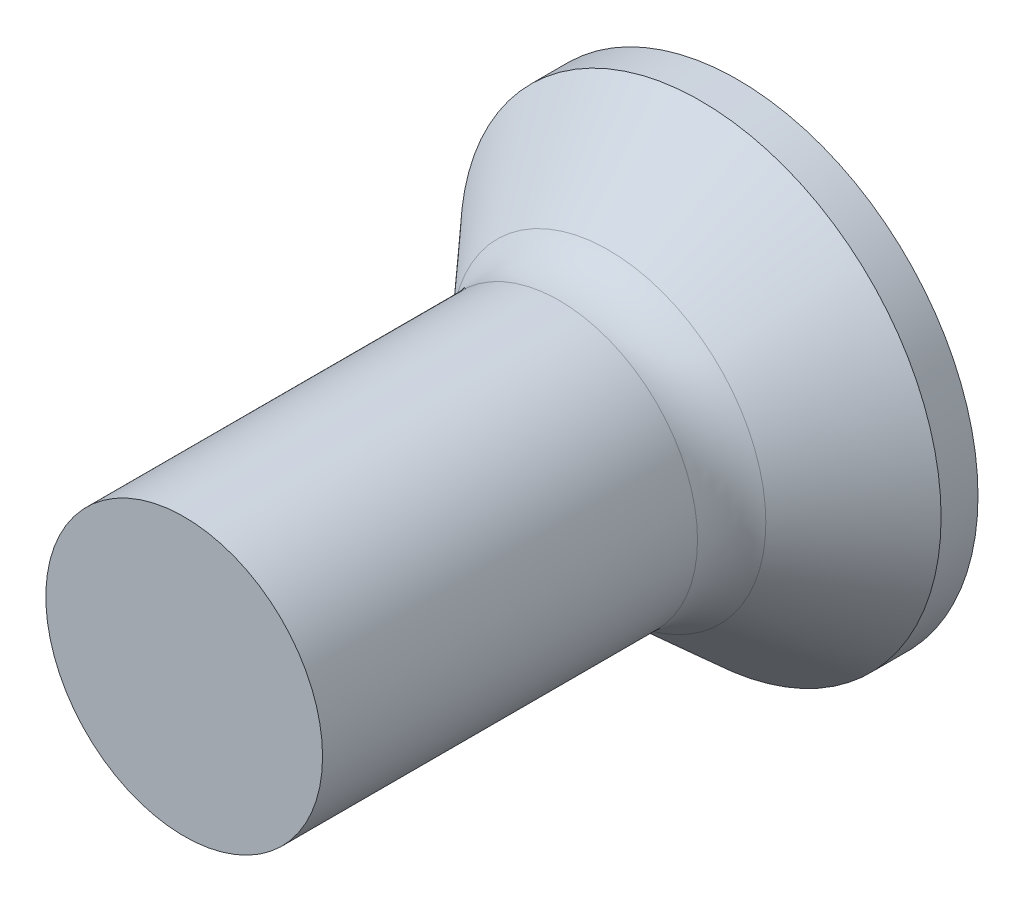
ISO-10303-21;
HEADER;
FILE_DESCRIPTION(('STEP AP214'),'2;1');
FILE_NAME('part.step','',(''),(''),'','','');
FILE_SCHEMA(('AUTOMOTIVE_DESIGN { 1 0 10303 214 1 1 1 1 }'));
ENDSEC;
DATA;
#1=APPLICATION_CONTEXT('core data for automotive mechanical design processes');
#2=APPLICATION_PROTOCOL_DEFINITION('international standard','automotive_design',2000,#1);
#3=PRODUCT_CONTEXT('',#1,'mechanical');
#4=PRODUCT('Part','Part','',(#3));
#5=PRODUCT_RELATED_PRODUCT_CATEGORY('part','',(#4));
#6=PRODUCT_DEFINITION_FORMATION('','',#4);
#7=PRODUCT_DEFINITION_CONTEXT('part definition',#1,'design');
#8=PRODUCT_DEFINITION('design','',#6,#7);
#9=PRODUCT_DEFINITION_SHAPE('','',#8);
#10=(LENGTH_UNIT() NAMED_UNIT(*) SI_UNIT(.MILLI.,.METRE.));
#11=(NAMED_UNIT(*) PLANE_ANGLE_UNIT() SI_UNIT($,.RADIAN.));
#12=(NAMED_UNIT(*) SI_UNIT($,.STERADIAN.) SOLID_ANGLE_UNIT());
#13=UNCERTAINTY_MEASURE_WITH_UNIT(LENGTH_MEASURE(1.E-05),#10,'distance_accuracy_value','');
#14=(GEOMETRIC_REPRESENTATION_CONTEXT(3) GLOBAL_UNCERTAINTY_ASSIGNED_CONTEXT((#13)) GLOBAL_UNIT_ASSIGNED_CONTEXT((#10,
#11,#12)) REPRESENTATION_CONTEXT('',''));
#15=CARTESIAN_POINT('',(0.,0.,0.));
#16=DIRECTION('',(0.,0.,1.));
#17=DIRECTION('',(1.,0.,0.));
#18=AXIS2_PLACEMENT_3D('',#15,#16,#17);
#19=CARTESIAN_POINT('',(0.35,0.5,-1.));
#20=DIRECTION('',(0.,0.,-1.));
#21=DIRECTION('',(-1.,0.,0.));
#22=AXIS2_PLACEMENT_3D('',#19,#20,#21);
#23=PLANE('',#22);
#24=DIRECTION('',(0.,-1.,0.));
#25=VECTOR('',#24,1.);
#26=CARTESIAN_POINT('',(-0.500000000000001,0.349999999999998,-1.));
#27=LINE('',#26,#25);
#28=CARTESIAN_POINT('',(-0.499999999999999,-0.229128784747794,-1.));
#29=VERTEX_POINT('',#28);
#30=CARTESIAN_POINT('',(-0.499999999999999,-0.350000000000002,-1.));
#31=VERTEX_POINT('',#30);
#32=EDGE_CURVE('E284',#29,#31,#27,.T.);
#33=ORIENTED_EDGE('',*,*,#32,.F.);
#34=CARTESIAN_POINT('',(0.,0.,-1.));
#35=DIRECTION('',(0.,0.,-1.));
#36=DIRECTION('',(-1.,0.,0.));
#37=AXIS2_PLACEMENT_3D('',#34,#35,#36);
#38=CIRCLE('',#37,0.55);
#39=CARTESIAN_POINT('',(-0.424264068711927,-0.350000000000001,-1.));
#40=VERTEX_POINT('',#39);
#41=EDGE_CURVE('E211',#29,#40,#38,.F.);
#42=ORIENTED_EDGE('',*,*,#41,.T.);
#43=DIRECTION('',(1.,0.,0.));
#44=VECTOR('',#43,1.);
#45=CARTESIAN_POINT('',(-0.499999999999999,-0.350000000000002,-1.));
#46=LINE('',#45,#44);
#47=EDGE_CURVE('E271',#31,#40,#46,.T.);
#48=ORIENTED_EDGE('',*,*,#47,.F.);
#49=EDGE_LOOP('',(#33,#42,#48));
#50=FACE_BOUND('',#49,.T.);
#51=ADVANCED_FACE('F34',(#50),#23,.T.);
#52=DIRECTION('',(0.,1.,0.));
#53=VECTOR('',#52,1.);
#54=CARTESIAN_POINT('',(-0.35,-0.5,-1.));
#55=LINE('',#54,#53);
#56=CARTESIAN_POINT('',(-0.35,-0.5,-1.));
#57=VERTEX_POINT('',#56);
#58=CARTESIAN_POINT('',(-0.35,-0.424264068711929,-1.));
#59=VERTEX_POINT('',#58);
#60=EDGE_CURVE('E256',#57,#59,#55,.T.);
#61=ORIENTED_EDGE('',*,*,#60,.T.);
#62=CARTESIAN_POINT('',(-0.229128784747792,-0.5,-1.));
#63=VERTEX_POINT('',#62);
#64=EDGE_CURVE('E205',#59,#63,#38,.F.);
#65=ORIENTED_EDGE('',*,*,#64,.T.);
#66=DIRECTION('',(1.,0.,0.));
#67=VECTOR('',#66,1.);
#68=CARTESIAN_POINT('',(-0.35,-0.5,-1.));
#69=LINE('',#68,#67);
#70=EDGE_CURVE('E260',#57,#63,#69,.T.);
#71=ORIENTED_EDGE('',*,*,#70,.F.);
#72=EDGE_LOOP('',(#61,#65,#71));
#73=FACE_BOUND('',#72,.T.);
#74=ADVANCED_FACE('F340',(#73),#23,.T.);
#75=CARTESIAN_POINT('',(0.229128784747792,-0.5,-1.));
#76=VERTEX_POINT('',#75);
#77=CARTESIAN_POINT('',(0.35,-0.5,-1.));
#78=VERTEX_POINT('',#77);
#79=EDGE_CURVE('E259',#76,#78,#69,.T.);
#80=ORIENTED_EDGE('',*,*,#79,.F.);
#81=CARTESIAN_POINT('',(0.35,-0.424264068711929,-1.));
#82=VERTEX_POINT('',#81);
#83=EDGE_CURVE('E201',#76,#82,#38,.F.);
#84=ORIENTED_EDGE('',*,*,#83,.T.);
#85=DIRECTION('',(0.,1.,0.));
#86=VECTOR('',#85,1.);
#87=CARTESIAN_POINT('',(0.35,-0.5,-1.));
#88=LINE('',#87,#86);
#89=EDGE_CURVE('E249',#78,#82,#88,.T.);
#90=ORIENTED_EDGE('',*,*,#89,.F.);
#91=EDGE_LOOP('',(#80,#84,#90));
#92=FACE_BOUND('',#91,.T.);
#93=ADVANCED_FACE('F347',(#92),#23,.T.);
#94=DIRECTION('',(-1.,0.,0.));
#95=VECTOR('',#94,1.);
#96=CARTESIAN_POINT('',(0.500000000000004,-0.349999999999995,-1.));
#97=LINE('',#96,#95);
#98=CARTESIAN_POINT('',(0.500000000000004,-0.349999999999995,-1.));
#99=VERTEX_POINT('',#98);
#100=CARTESIAN_POINT('',(0.424264068711932,-0.349999999999996,-1.));
#101=VERTEX_POINT('',#100);
#102=EDGE_CURVE('E234',#99,#101,#97,.T.);
#103=ORIENTED_EDGE('',*,*,#102,.T.);
#104=CARTESIAN_POINT('',(0.500000000000002,-0.229128784747786,-1.));
#105=VERTEX_POINT('',#104);
#106=EDGE_CURVE('E192',#101,#105,#38,.F.);
#107=ORIENTED_EDGE('',*,*,#106,.T.);
#108=DIRECTION('',(0.,1.,0.));
#109=VECTOR('',#108,1.);
#110=CARTESIAN_POINT('',(0.500000000000004,-0.349999999999995,-1.));
#111=LINE('',#110,#109);
#112=EDGE_CURVE('E238',#99,#105,#111,.T.);
#113=ORIENTED_EDGE('',*,*,#112,.F.);
#114=EDGE_LOOP('',(#103,#107,#113));
#115=FACE_BOUND('',#114,.T.);
#116=ADVANCED_FACE('F402',(#115),#23,.T.);
#117=CARTESIAN_POINT('',(0.499999999999998,0.229128784747797,-1.));
#118=VERTEX_POINT('',#117);
#119=CARTESIAN_POINT('',(0.499999999999996,0.350000000000005,-1.));
#120=VERTEX_POINT('',#119);
#121=EDGE_CURVE('E237',#118,#120,#111,.T.);
#122=ORIENTED_EDGE('',*,*,#121,.F.);
#123=CARTESIAN_POINT('',(0.424264068711927,0.350000000000001,-1.));
#124=VERTEX_POINT('',#123);
#125=EDGE_CURVE('E49',#118,#124,#38,.F.);
#126=ORIENTED_EDGE('',*,*,#125,.T.);
#127=DIRECTION('',(1.,0.,0.));
#128=VECTOR('',#127,1.);
#129=CARTESIAN_POINT('',(-0.500000000000001,0.349999999999998,-1.));
#130=LINE('',#129,#128);
#131=EDGE_CURVE('E280',#124,#120,#130,.T.);
#132=ORIENTED_EDGE('',*,*,#131,.T.);
#133=EDGE_LOOP('',(#122,#126,#132));
#134=FACE_BOUND('',#133,.T.);
#135=ADVANCED_FACE('F375',(#134),#23,.T.);
#136=DIRECTION('',(0.,-1.,0.));
#137=VECTOR('',#136,1.);
#138=CARTESIAN_POINT('',(0.35,0.5,-1.));
#139=LINE('',#138,#137);
#140=CARTESIAN_POINT('',(0.35,0.5,-1.));
#141=VERTEX_POINT('',#140);
#142=CARTESIAN_POINT('',(0.35,0.424264068711929,-1.));
#143=VERTEX_POINT('',#142);
#144=EDGE_CURVE('E302',#141,#143,#139,.T.);
#145=ORIENTED_EDGE('',*,*,#144,.T.);
#146=CARTESIAN_POINT('',(0.229128784747792,0.5,-1.));
#147=VERTEX_POINT('',#146);
#148=EDGE_CURVE('E193',#143,#147,#38,.F.);
#149=ORIENTED_EDGE('',*,*,#148,.T.);
#150=DIRECTION('',(-1.,0.,0.));
#151=VECTOR('',#150,1.);
#152=CARTESIAN_POINT('',(0.35,0.5,-1.));
#153=LINE('',#152,#151);
#154=EDGE_CURVE('E306',#141,#147,#153,.T.);
#155=ORIENTED_EDGE('',*,*,#154,.F.);
#156=EDGE_LOOP('',(#145,#149,#155));
#157=FACE_BOUND('',#156,.T.);
#158=ADVANCED_FACE('F367',(#157),#23,.T.);
#159=CARTESIAN_POINT('',(-0.229128784747792,0.5,-1.));
#160=VERTEX_POINT('',#159);
#161=CARTESIAN_POINT('',(-0.35,0.5,-1.));
#162=VERTEX_POINT('',#161);
#163=EDGE_CURVE('E305',#160,#162,#153,.T.);
#164=ORIENTED_EDGE('',*,*,#163,.F.);
#165=CARTESIAN_POINT('',(-0.35,0.424264068711929,-1.));
#166=VERTEX_POINT('',#165);
#167=EDGE_CURVE('E221',#160,#166,#38,.F.);
#168=ORIENTED_EDGE('',*,*,#167,.T.);
#169=DIRECTION('',(0.,-1.,0.));
#170=VECTOR('',#169,1.);
#171=CARTESIAN_POINT('',(-0.35,0.5,-1.));
#172=LINE('',#171,#170);
#173=EDGE_CURVE('E296',#162,#166,#172,.T.);
#174=ORIENTED_EDGE('',*,*,#173,.F.);
#175=EDGE_LOOP('',(#164,#168,#174));
#176=FACE_BOUND('',#175,.T.);
#177=ADVANCED_FACE('F356',(#176),#23,.T.);
#178=CARTESIAN_POINT('',(0.35,0.,0.));
#179=DIRECTION('',(1.,0.,0.));
#180=DIRECTION('',(0.,0.,-1.));
#181=AXIS2_PLACEMENT_3D('',#178,#179,#180);
#182=PLANE('',#181);
#183=DIRECTION('',(0.,0.,1.));
#184=VECTOR('',#183,1.);
#185=CARTESIAN_POINT('',(0.35,0.424264068711929,0.));
#186=LINE('',#185,#184);
#187=CARTESIAN_POINT('',(0.35,0.424264068711929,-3.));
#188=VERTEX_POINT('',#187);
#189=EDGE_CURVE('E225',#143,#188,#186,.F.);
#190=ORIENTED_EDGE('',*,*,#189,.F.);
#191=ORIENTED_EDGE('',*,*,#144,.F.);
#192=DIRECTION('',(0.,-0.446197813109803,0.894934361602028));
#193=VECTOR('',#192,1.);
#194=CARTESIAN_POINT('',(0.35,1.49716321610685,-3.));
#195=LINE('',#194,#193);
#196=CARTESIAN_POINT('',(0.35,1.49716321610685,-3.));
#197=VERTEX_POINT('',#196);
#198=EDGE_CURVE('E56',#197,#141,#195,.T.);
#199=ORIENTED_EDGE('',*,*,#198,.F.);
#200=DIRECTION('',(0.,1.,0.));
#201=VECTOR('',#200,1.);
#202=CARTESIAN_POINT('',(0.35,0.,-3.));
#203=LINE('',#202,#201);
#204=EDGE_CURVE('E299',#188,#197,#203,.T.);
#205=ORIENTED_EDGE('',*,*,#204,.F.);
#206=EDGE_LOOP('',(#190,#191,#199,#205));
#207=FACE_BOUND('',#206,.T.);
#208=ADVANCED_FACE('F366',(#207),#182,.F.);
#209=CARTESIAN_POINT('',(-0.35,0.,0.));
#210=DIRECTION('',(1.,0.,0.));
#211=DIRECTION('',(0.,0.,-1.));
#212=AXIS2_PLACEMENT_3D('',#209,#210,#211);
#213=PLANE('',#212);
#214=ORIENTED_EDGE('',*,*,#173,.T.);
#215=DIRECTION('',(0.,0.,1.));
#216=VECTOR('',#215,1.);
#217=CARTESIAN_POINT('',(-0.35,0.424264068711929,0.));
#218=LINE('',#217,#216);
#219=CARTESIAN_POINT('',(-0.35,0.424264068711929,-3.));
#220=VERTEX_POINT('',#219);
#221=EDGE_CURVE('E218',#166,#220,#218,.F.);
#222=ORIENTED_EDGE('',*,*,#221,.T.);
#223=DIRECTION('',(0.,1.,0.));
#224=VECTOR('',#223,1.);
#225=CARTESIAN_POINT('',(-0.35,0.,-3.));
#226=LINE('',#225,#224);
#227=CARTESIAN_POINT('',(-0.35,1.49716321610685,-3.));
#228=VERTEX_POINT('',#227);
#229=EDGE_CURVE('E291',#220,#228,#226,.T.);
#230=ORIENTED_EDGE('',*,*,#229,.T.);
#231=DIRECTION('',(0.,-0.446197813109803,0.894934361602028));
#232=VECTOR('',#231,1.);
#233=CARTESIAN_POINT('',(-0.35,1.49716321610685,-3.));
#234=LINE('',#233,#232);
#235=EDGE_CURVE('E293',#228,#162,#234,.T.);
#236=ORIENTED_EDGE('',*,*,#235,.T.);
#237=EDGE_LOOP('',(#214,#222,#230,#236));
#238=FACE_BOUND('',#237,.T.);
#239=ADVANCED_FACE('F373',(#238),#213,.T.);
#240=CARTESIAN_POINT('',(0.,0.35,0.));
#241=DIRECTION('',(0.,1.,0.));
#242=DIRECTION('',(0.,0.,-1.));
#243=AXIS2_PLACEMENT_3D('',#240,#241,#242);
#244=PLANE('',#243);
#245=DIRECTION('',(0.,0.,1.));
#246=VECTOR('',#245,1.);
#247=CARTESIAN_POINT('',(0.424264068711927,0.350000000000001,0.));
#248=LINE('',#247,#246);
#249=CARTESIAN_POINT('',(0.424264068711927,0.350000000000002,-3.));
#250=VERTEX_POINT('',#249);
#251=EDGE_CURVE('E196',#250,#124,#248,.T.);
#252=ORIENTED_EDGE('',*,*,#251,.F.);
#253=DIRECTION('',(-1.,0.,0.));
#254=VECTOR('',#253,1.);
#255=CARTESIAN_POINT('',(0.,0.35,-3.));
#256=LINE('',#255,#254);
#257=CARTESIAN_POINT('',(1.49716321610684,0.350000000000016,-3.));
#258=VERTEX_POINT('',#257);
#259=EDGE_CURVE('E275',#258,#250,#256,.T.);
#260=ORIENTED_EDGE('',*,*,#259,.F.);
#261=DIRECTION('',(-0.446197813109803,0.,0.894934361602028));
#262=VECTOR('',#261,1.);
#263=CARTESIAN_POINT('',(1.49716321610684,0.350000000000016,-3.));
#264=LINE('',#263,#262);
#265=EDGE_CURVE('E227',#258,#120,#264,.T.);
#266=ORIENTED_EDGE('',*,*,#265,.T.);
#267=ORIENTED_EDGE('',*,*,#131,.F.);
#268=EDGE_LOOP('',(#252,#260,#266,#267));
#269=FACE_BOUND('',#268,.T.);
#270=ADVANCED_FACE('F434',(#269),#244,.F.);
#271=DIRECTION('',(0.,0.,1.));
#272=VECTOR('',#271,1.);
#273=CARTESIAN_POINT('',(-0.42426406871193,0.349999999999999,0.));
#274=LINE('',#273,#272);
#275=CARTESIAN_POINT('',(-0.42426406871193,0.349999999999999,-1.));
#276=VERTEX_POINT('',#275);
#277=CARTESIAN_POINT('',(-0.42426406871193,0.349999999999999,-3.));
#278=VERTEX_POINT('',#277);
#279=EDGE_CURVE('E216',#276,#278,#274,.F.);
#280=ORIENTED_EDGE('',*,*,#279,.F.);
#281=CARTESIAN_POINT('',(-0.500000000000001,0.349999999999998,-1.));
#282=VERTEX_POINT('',#281);
#283=EDGE_CURVE('E281',#282,#276,#130,.T.);
#284=ORIENTED_EDGE('',*,*,#283,.F.);
#285=DIRECTION('',(0.446197813109803,0.,0.894934361602028));
#286=VECTOR('',#285,1.);
#287=CARTESIAN_POINT('',(-1.49716321610685,0.349999999999995,-3.));
#288=LINE('',#287,#286);
#289=CARTESIAN_POINT('',(-1.49716321610685,0.349999999999995,-3.));
#290=VERTEX_POINT('',#289);
#291=EDGE_CURVE('E278',#290,#282,#288,.T.);
#292=ORIENTED_EDGE('',*,*,#291,.F.);
#293=EDGE_CURVE('E274',#278,#290,#256,.T.);
#294=ORIENTED_EDGE('',*,*,#293,.F.);
#295=EDGE_LOOP('',(#280,#284,#292,#294));
#296=FACE_BOUND('',#295,.T.);
#297=ADVANCED_FACE('F436',(#296),#244,.F.);
#298=CARTESIAN_POINT('',(0.,-0.35,0.));
#299=DIRECTION('',(0.,1.,0.));
#300=DIRECTION('',(0.,0.,-1.));
#301=AXIS2_PLACEMENT_3D('',#298,#299,#300);
#302=PLANE('',#301);
#303=ORIENTED_EDGE('',*,*,#47,.T.);
#304=DIRECTION('',(0.,0.,1.));
#305=VECTOR('',#304,1.);
#306=CARTESIAN_POINT('',(-0.424264068711927,-0.350000000000001,0.));
#307=LINE('',#306,#305);
#308=CARTESIAN_POINT('',(-0.424264068711927,-0.350000000000002,-3.));
#309=VERTEX_POINT('',#308);
#310=EDGE_CURVE('E208',#40,#309,#307,.F.);
#311=ORIENTED_EDGE('',*,*,#310,.T.);
#312=DIRECTION('',(-1.,0.,0.));
#313=VECTOR('',#312,1.);
#314=CARTESIAN_POINT('',(0.,-0.35,-3.));
#315=LINE('',#314,#313);
#316=CARTESIAN_POINT('',(-1.49716321610685,-0.350000000000005,-3.));
#317=VERTEX_POINT('',#316);
#318=EDGE_CURVE('E266',#309,#317,#315,.T.);
#319=ORIENTED_EDGE('',*,*,#318,.T.);
#320=DIRECTION('',(0.446197813109803,0.,0.894934361602028));
#321=VECTOR('',#320,1.);
#322=CARTESIAN_POINT('',(-1.49716321610685,-0.350000000000005,-3.));
#323=LINE('',#322,#321);
#324=EDGE_CURVE('E268',#317,#31,#323,.T.);
#325=ORIENTED_EDGE('',*,*,#324,.T.);
#326=EDGE_LOOP('',(#303,#311,#319,#325));
#327=FACE_BOUND('',#326,.T.);
#328=ADVANCED_FACE('F442',(#327),#302,.T.);
#329=CARTESIAN_POINT('',(-0.35,0.,0.));
#330=DIRECTION('',(-1.,0.,0.));
#331=DIRECTION('',(0.,0.,-1.));
#332=AXIS2_PLACEMENT_3D('',#329,#330,#331);
#333=PLANE('',#332);
#334=DIRECTION('',(0.,0.,1.));
#335=VECTOR('',#334,1.);
#336=CARTESIAN_POINT('',(-0.35,-0.424264068711929,0.));
#337=LINE('',#336,#335);
#338=CARTESIAN_POINT('',(-0.35,-0.424264068711929,-3.));
#339=VERTEX_POINT('',#338);
#340=EDGE_CURVE('E206',#59,#339,#337,.F.);
#341=ORIENTED_EDGE('',*,*,#340,.F.);
#342=ORIENTED_EDGE('',*,*,#60,.F.);
#343=DIRECTION('',(0.,0.446197813109803,0.894934361602028));
#344=VECTOR('',#343,1.);
#345=CARTESIAN_POINT('',(-0.35,-1.49716321610685,-3.));
#346=LINE('',#345,#344);
#347=CARTESIAN_POINT('',(-0.35,-1.49716321610685,-3.));
#348=VERTEX_POINT('',#347);
#349=EDGE_CURVE('E254',#348,#57,#346,.T.);
#350=ORIENTED_EDGE('',*,*,#349,.F.);
#351=DIRECTION('',(0.,-1.,0.));
#352=VECTOR('',#351,1.);
#353=CARTESIAN_POINT('',(-0.35,0.,-3.));
#354=LINE('',#353,#352);
#355=EDGE_CURVE('E252',#339,#348,#354,.T.);
#356=ORIENTED_EDGE('',*,*,#355,.F.);
#357=EDGE_LOOP('',(#341,#342,#350,#356));
#358=FACE_BOUND('',#357,.T.);
#359=ADVANCED_FACE('F448',(#358),#333,.F.);
#360=CARTESIAN_POINT('',(0.35,0.,0.));
#361=DIRECTION('',(-1.,0.,0.));
#362=DIRECTION('',(0.,0.,-1.));
#363=AXIS2_PLACEMENT_3D('',#360,#361,#362);
#364=PLANE('',#363);
#365=ORIENTED_EDGE('',*,*,#89,.T.);
#366=DIRECTION('',(0.,0.,1.));
#367=VECTOR('',#366,1.);
#368=CARTESIAN_POINT('',(0.35,-0.424264068711929,0.));
#369=LINE('',#368,#367);
#370=CARTESIAN_POINT('',(0.35,-0.424264068711929,-3.));
#371=VERTEX_POINT('',#370);
#372=EDGE_CURVE('E198',#82,#371,#369,.F.);
#373=ORIENTED_EDGE('',*,*,#372,.T.);
#374=DIRECTION('',(0.,-1.,0.));
#375=VECTOR('',#374,1.);
#376=CARTESIAN_POINT('',(0.35,0.,-3.));
#377=LINE('',#376,#375);
#378=CARTESIAN_POINT('',(0.35,-1.49716321610685,-3.));
#379=VERTEX_POINT('',#378);
#380=EDGE_CURVE('E244',#371,#379,#377,.T.);
#381=ORIENTED_EDGE('',*,*,#380,.T.);
#382=DIRECTION('',(0.,0.446197813109803,0.894934361602028));
#383=VECTOR('',#382,1.);
#384=CARTESIAN_POINT('',(0.35,-1.49716321610685,-3.));
#385=LINE('',#384,#383);
#386=EDGE_CURVE('E246',#379,#78,#385,.T.);
#387=ORIENTED_EDGE('',*,*,#386,.T.);
#388=EDGE_LOOP('',(#365,#373,#381,#387));
#389=FACE_BOUND('',#388,.T.);
#390=ADVANCED_FACE('F418',(#389),#364,.T.);
#391=CARTESIAN_POINT('',(0.,-0.35,0.));
#392=DIRECTION('',(0.,-1.,0.));
#393=DIRECTION('',(0.,0.,-1.));
#394=AXIS2_PLACEMENT_3D('',#391,#392,#393);
#395=PLANE('',#394);
#396=DIRECTION('',(0.,0.,1.));
#397=VECTOR('',#396,1.);
#398=CARTESIAN_POINT('',(0.424264068711932,-0.349999999999996,0.));
#399=LINE('',#398,#397);
#400=CARTESIAN_POINT('',(0.424264068711932,-0.349999999999996,-3.));
#401=VERTEX_POINT('',#400);
#402=EDGE_CURVE('E194',#101,#401,#399,.F.);
#403=ORIENTED_EDGE('',*,*,#402,.F.);
#404=ORIENTED_EDGE('',*,*,#102,.F.);
#405=DIRECTION('',(-0.446197813109803,0.,0.894934361602028));
#406=VECTOR('',#405,1.);
#407=CARTESIAN_POINT('',(1.49716321610685,-0.349999999999984,-3.));
#408=LINE('',#407,#406);
#409=CARTESIAN_POINT('',(1.49716321610685,-0.349999999999984,-3.));
#410=VERTEX_POINT('',#409);
#411=EDGE_CURVE('E232',#410,#99,#408,.T.);
#412=ORIENTED_EDGE('',*,*,#411,.F.);
#413=DIRECTION('',(1.,0.,0.));
#414=VECTOR('',#413,1.);
#415=CARTESIAN_POINT('',(0.,-0.35,-3.));
#416=LINE('',#415,#414);
#417=EDGE_CURVE('E230',#401,#410,#416,.T.);
#418=ORIENTED_EDGE('',*,*,#417,.F.);
#419=EDGE_LOOP('',(#403,#404,#412,#418));
#420=FACE_BOUND('',#419,.T.);
#421=ADVANCED_FACE('F337',(#420),#395,.F.);
#422=CARTESIAN_POINT('',(0.,1.5,3.));
#423=DIRECTION('',(0.,0.,-1.));
#424=DIRECTION('',(-1.,0.,0.));
#425=AXIS2_PLACEMENT_3D('',#422,#423,#424);
#426=PLANE('',#425);
#427=CARTESIAN_POINT('',(0.,0.,3.));
#428=DIRECTION('',(0.,0.,1.));
#429=DIRECTION('',(1.,0.,0.));
#430=AXIS2_PLACEMENT_3D('',#427,#428,#429);
#431=CIRCLE('',#430,1.5);
#432=CARTESIAN_POINT('',(1.5,0.,3.));
#433=VERTEX_POINT('',#432);
#434=EDGE_CURVE('E311',#433,#433,#431,.T.);
#435=ORIENTED_EDGE('',*,*,#434,.T.);
#436=EDGE_LOOP('',(#435));
#437=FACE_BOUND('',#436,.T.);
#438=ADVANCED_FACE('F36',(#437),#426,.F.);
#439=CARTESIAN_POINT('',(0.,0.,-3.));
#440=DIRECTION('',(0.,0.,1.));
#441=DIRECTION('',(1.,0.,0.));
#442=AXIS2_PLACEMENT_3D('',#439,#440,#441);
#443=PLANE('',#442);
#444=CARTESIAN_POINT('',(0.,0.,-3.));
#445=DIRECTION('',(0.,0.,1.));
#446=DIRECTION('',(1.,0.,0.));
#447=AXIS2_PLACEMENT_3D('',#444,#445,#446);
#448=CIRCLE('',#447,0.55);
#449=EDGE_CURVE('E182',#371,#401,#448,.T.);
#450=ORIENTED_EDGE('',*,*,#449,.T.);
#451=ORIENTED_EDGE('',*,*,#417,.T.);
#452=DIRECTION('',(0.,1.,0.));
#453=VECTOR('',#452,1.);
#454=CARTESIAN_POINT('',(1.49716321610685,-0.349999999999984,-3.));
#455=LINE('',#454,#453);
#456=EDGE_CURVE('E241',#410,#258,#455,.T.);
#457=ORIENTED_EDGE('',*,*,#456,.T.);
#458=ORIENTED_EDGE('',*,*,#259,.T.);
#459=EDGE_CURVE('E187',#250,#188,#448,.T.);
#460=ORIENTED_EDGE('',*,*,#459,.T.);
#461=ORIENTED_EDGE('',*,*,#204,.T.);
#462=DIRECTION('',(-1.,0.,0.));
#463=VECTOR('',#462,1.);
#464=CARTESIAN_POINT('',(0.35,1.49716321610685,-3.));
#465=LINE('',#464,#463);
#466=EDGE_CURVE('E308',#197,#228,#465,.T.);
#467=ORIENTED_EDGE('',*,*,#466,.T.);
#468=ORIENTED_EDGE('',*,*,#229,.F.);
#469=EDGE_CURVE('E190',#220,#278,#448,.T.);
#470=ORIENTED_EDGE('',*,*,#469,.T.);
#471=ORIENTED_EDGE('',*,*,#293,.T.);
#472=DIRECTION('',(0.,-1.,0.));
#473=VECTOR('',#472,1.);
#474=CARTESIAN_POINT('',(-1.49716321610685,0.349999999999995,-3.));
#475=LINE('',#474,#473);
#476=EDGE_CURVE('E288',#290,#317,#475,.T.);
#477=ORIENTED_EDGE('',*,*,#476,.T.);
#478=ORIENTED_EDGE('',*,*,#318,.F.);
#479=EDGE_CURVE('E185',#309,#339,#448,.T.);
#480=ORIENTED_EDGE('',*,*,#479,.T.);
#481=ORIENTED_EDGE('',*,*,#355,.T.);
#482=DIRECTION('',(1.,0.,0.));
#483=VECTOR('',#482,1.);
#484=CARTESIAN_POINT('',(-0.35,-1.49716321610685,-3.));
#485=LINE('',#484,#483);
#486=EDGE_CURVE('E263',#348,#379,#485,.T.);
#487=ORIENTED_EDGE('',*,*,#486,.T.);
#488=ORIENTED_EDGE('',*,*,#380,.F.);
#489=EDGE_LOOP('',(#450,#451,#457,#458,#460,#461,#467,#468,#470,#471,#477,#478,#480,#481,#487,#488));
#490=FACE_BOUND('',#489,.T.);
#491=CARTESIAN_POINT('',(0.,0.,-3.));
#492=DIRECTION('',(0.,0.,1.));
#493=DIRECTION('',(1.,0.,0.));
#494=AXIS2_PLACEMENT_3D('',#491,#492,#493);
#495=CIRCLE('',#494,2.60536468300227);
#496=CARTESIAN_POINT('',(2.60536468300227,0.,-3.));
#497=VERTEX_POINT('',#496);
#498=EDGE_CURVE('E42',#497,#497,#495,.T.);
#499=ORIENTED_EDGE('',*,*,#498,.F.);
#500=EDGE_LOOP('',(#499));
#501=FACE_BOUND('',#500,.T.);
#502=ADVANCED_FACE('F327',(#490,#501),#443,.F.);
#503=CARTESIAN_POINT('',(0.,0.,-3.));
#504=DIRECTION('',(0.,0.,1.));
#505=DIRECTION('',(1.,0.,0.));
#506=AXIS2_PLACEMENT_3D('',#503,#504,#505);
#507=CYLINDRICAL_SURFACE('',#506,2.60536468300227);
#508=CARTESIAN_POINT('',(0.,0.,-2.6));
#509=DIRECTION('',(0.,0.,1.));
#510=DIRECTION('',(1.,0.,0.));
#511=AXIS2_PLACEMENT_3D('',#508,#509,#510);
#512=CIRCLE('',#511,2.60536468300227);
#513=CARTESIAN_POINT('',(2.60536468300227,0.,-2.6));
#514=VERTEX_POINT('',#513);
#515=EDGE_CURVE('E320',#514,#514,#512,.T.);
#516=ORIENTED_EDGE('',*,*,#515,.F.);
#517=EDGE_LOOP('',(#516));
#518=FACE_BOUND('',#517,.T.);
#519=ORIENTED_EDGE('',*,*,#498,.T.);
#520=EDGE_LOOP('',(#519));
#521=FACE_BOUND('',#520,.T.);
#522=ADVANCED_FACE('F325',(#518,#521),#507,.T.);
#523=CARTESIAN_POINT('',(0.,0.,-2.6));
#524=DIRECTION('',(0.,0.,-1.));
#525=DIRECTION('',(-1.,0.,0.));
#526=AXIS2_PLACEMENT_3D('',#523,#524,#525);
#527=CONICAL_SURFACE('',#526,2.60536468300227,0.732815101786507);
#528=CARTESIAN_POINT('',(0.,0.,-1.6));
#529=DIRECTION('',(0.,0.,1.));
#530=DIRECTION('',(1.,0.,0.));
#531=AXIS2_PLACEMENT_3D('',#528,#529,#530);
#532=CIRCLE('',#531,1.70536468300227);
#533=CARTESIAN_POINT('',(1.70536468300227,0.,-1.6));
#534=VERTEX_POINT('',#533);
#535=EDGE_CURVE('E317',#534,#534,#532,.T.);
#536=ORIENTED_EDGE('',*,*,#535,.F.);
#537=EDGE_LOOP('',(#536));
#538=FACE_BOUND('',#537,.T.);
#539=ORIENTED_EDGE('',*,*,#515,.T.);
#540=EDGE_LOOP('',(#539));
#541=FACE_BOUND('',#540,.T.);
#542=ADVANCED_FACE('F334',(#538,#541),#527,.T.);
#543=CARTESIAN_POINT('',(0.,0.,-1.06482821470204));
#544=DIRECTION('',(0.,0.,1.));
#545=DIRECTION('',(1.,0.,0.));
#546=AXIS2_PLACEMENT_3D('',#543,#544,#545);
#547=TOROIDAL_SURFACE('',#546,2.3,0.8);
#548=CARTESIAN_POINT('',(0.,0.,-1.06482821470204));
#549=DIRECTION('',(0.,0.,1.));
#550=DIRECTION('',(1.,0.,0.));
#551=AXIS2_PLACEMENT_3D('',#548,#549,#550);
#552=CIRCLE('',#551,1.5);
#553=CARTESIAN_POINT('',(1.5,0.,-1.06482821470204));
#554=VERTEX_POINT('',#553);
#555=EDGE_CURVE('E314',#554,#554,#552,.T.);
#556=ORIENTED_EDGE('',*,*,#555,.F.);
#557=EDGE_LOOP('',(#556));
#558=FACE_BOUND('',#557,.T.);
#559=ORIENTED_EDGE('',*,*,#535,.T.);
#560=EDGE_LOOP('',(#559));
#561=FACE_BOUND('',#560,.T.);
#562=ADVANCED_FACE('F621',(#558,#561),#547,.F.);
#563=CARTESIAN_POINT('',(0.,0.,-3.));
#564=DIRECTION('',(0.,0.,1.));
#565=DIRECTION('',(1.,0.,0.));
#566=AXIS2_PLACEMENT_3D('',#563,#564,#565);
#567=CYLINDRICAL_SURFACE('',#566,1.5);
#568=ORIENTED_EDGE('',*,*,#434,.F.);
#569=EDGE_LOOP('',(#568));
#570=FACE_BOUND('',#569,.T.);
#571=ORIENTED_EDGE('',*,*,#555,.T.);
#572=EDGE_LOOP('',(#571));
#573=FACE_BOUND('',#572,.T.);
#574=ADVANCED_FACE('F364',(#570,#573),#567,.T.);
#575=CARTESIAN_POINT('',(0.35,1.49716321610685,-3.));
#576=DIRECTION('',(0.,-0.894934361602028,-0.446197813109803));
#577=DIRECTION('',(0.,0.446197813109803,-0.894934361602028));
#578=AXIS2_PLACEMENT_3D('',#575,#576,#577);
#579=PLANE('',#578);
#580=ORIENTED_EDGE('',*,*,#154,.T.);
#581=CARTESIAN_POINT('',(0.,0.,0.00284485412952467));
#582=DIRECTION('',(0.,-0.894934361602028,-0.446197813109803));
#583=DIRECTION('',(0.,-0.446197813109803,0.894934361602028));
#584=AXIS2_PLACEMENT_3D('',#581,#582,#583);
#585=ELLIPSE('',#584,1.23263714845831,0.55);
#586=EDGE_CURVE('E222',#147,#160,#585,.F.);
#587=ORIENTED_EDGE('',*,*,#586,.T.);
#588=ORIENTED_EDGE('',*,*,#163,.T.);
#589=ORIENTED_EDGE('',*,*,#235,.F.);
#590=ORIENTED_EDGE('',*,*,#466,.F.);
#591=ORIENTED_EDGE('',*,*,#198,.T.);
#592=EDGE_LOOP('',(#580,#587,#588,#589,#590,#591));
#593=FACE_BOUND('',#592,.T.);
#594=ADVANCED_FACE('F354',(#593),#579,.T.);
#595=ORIENTED_EDGE('',*,*,#283,.T.);
#596=CARTESIAN_POINT('',(-0.500000000000001,0.22912878474779,-1.));
#597=VERTEX_POINT('',#596);
#598=EDGE_CURVE('E215',#276,#597,#38,.F.);
#599=ORIENTED_EDGE('',*,*,#598,.T.);
#600=EDGE_CURVE('E285',#282,#597,#27,.T.);
#601=ORIENTED_EDGE('',*,*,#600,.F.);
#602=EDGE_LOOP('',(#595,#599,#601));
#603=FACE_BOUND('',#602,.T.);
#604=ADVANCED_FACE('F343',(#603),#23,.T.);
#605=CARTESIAN_POINT('',(-1.49716321610685,0.349999999999995,-3.));
#606=DIRECTION('',(0.894934361602028,0.,-0.446197813109803));
#607=DIRECTION('',(-0.446197813109803,0.,-0.894934361602028));
#608=AXIS2_PLACEMENT_3D('',#605,#606,#607);
#609=PLANE('',#608);
#610=ORIENTED_EDGE('',*,*,#600,.T.);
#611=CARTESIAN_POINT('',(0.,0.,0.00284485412952516));
#612=DIRECTION('',(0.894934361602028,0.,-0.446197813109803));
#613=DIRECTION('',(0.446197813109803,0.,0.894934361602028));
#614=AXIS2_PLACEMENT_3D('',#611,#612,#613);
#615=ELLIPSE('',#614,1.23263714845831,0.55);
#616=EDGE_CURVE('E212',#597,#29,#615,.F.);
#617=ORIENTED_EDGE('',*,*,#616,.T.);
#618=ORIENTED_EDGE('',*,*,#32,.T.);
#619=ORIENTED_EDGE('',*,*,#324,.F.);
#620=ORIENTED_EDGE('',*,*,#476,.F.);
#621=ORIENTED_EDGE('',*,*,#291,.T.);
#622=EDGE_LOOP('',(#610,#617,#618,#619,#620,#621));
#623=FACE_BOUND('',#622,.T.);
#624=ADVANCED_FACE('F353',(#623),#609,.T.);
#625=CARTESIAN_POINT('',(-0.35,-1.49716321610685,-3.));
#626=DIRECTION('',(0.,0.894934361602028,-0.446197813109803));
#627=DIRECTION('',(0.,0.446197813109803,0.894934361602028));
#628=AXIS2_PLACEMENT_3D('',#625,#626,#627);
#629=PLANE('',#628);
#630=ORIENTED_EDGE('',*,*,#70,.T.);
#631=CARTESIAN_POINT('',(0.,0.,0.00284485412952467));
#632=DIRECTION('',(0.,0.894934361602028,-0.446197813109803));
#633=DIRECTION('',(0.,0.446197813109803,0.894934361602028));
#634=AXIS2_PLACEMENT_3D('',#631,#632,#633);
#635=ELLIPSE('',#634,1.23263714845831,0.55);
#636=EDGE_CURVE('E202',#63,#76,#635,.F.);
#637=ORIENTED_EDGE('',*,*,#636,.T.);
#638=ORIENTED_EDGE('',*,*,#79,.T.);
#639=ORIENTED_EDGE('',*,*,#386,.F.);
#640=ORIENTED_EDGE('',*,*,#486,.F.);
#641=ORIENTED_EDGE('',*,*,#349,.T.);
#642=EDGE_LOOP('',(#630,#637,#638,#639,#640,#641));
#643=FACE_BOUND('',#642,.T.);
#644=ADVANCED_FACE('F361',(#643),#629,.T.);
#645=CARTESIAN_POINT('',(1.49716321610685,-0.349999999999984,-3.));
#646=DIRECTION('',(-0.894934361602028,0.,-0.446197813109803));
#647=DIRECTION('',(-0.446197813109803,0.,0.894934361602028));
#648=AXIS2_PLACEMENT_3D('',#645,#646,#647);
#649=PLANE('',#648);
#650=ORIENTED_EDGE('',*,*,#112,.T.);
#651=CARTESIAN_POINT('',(0.,0.,0.00284485412952516));
#652=DIRECTION('',(-0.894934361602028,0.,-0.446197813109803));
#653=DIRECTION('',(-0.446197813109803,0.,0.894934361602028));
#654=AXIS2_PLACEMENT_3D('',#651,#652,#653);
#655=ELLIPSE('',#654,1.23263714845831,0.55);
#656=EDGE_CURVE('E11',#105,#118,#655,.F.);
#657=ORIENTED_EDGE('',*,*,#656,.T.);
#658=ORIENTED_EDGE('',*,*,#121,.T.);
#659=ORIENTED_EDGE('',*,*,#265,.F.);
#660=ORIENTED_EDGE('',*,*,#456,.F.);
#661=ORIENTED_EDGE('',*,*,#411,.T.);
#662=EDGE_LOOP('',(#650,#657,#658,#659,#660,#661));
#663=FACE_BOUND('',#662,.T.);
#664=ADVANCED_FACE('F406',(#663),#649,.T.);
#665=CARTESIAN_POINT('',(0.,0.,0.));
#666=DIRECTION('',(0.,0.,1.));
#667=DIRECTION('',(1.,0.,0.));
#668=AXIS2_PLACEMENT_3D('',#665,#666,#667);
#669=CYLINDRICAL_SURFACE('',#668,0.55);
#670=CARTESIAN_POINT('',(0.,0.,-0.978705832928101));
#671=DIRECTION('',(0.,0.,1.));
#672=DIRECTION('',(1.,0.,0.));
#673=AXIS2_PLACEMENT_3D('',#670,#671,#672);
#674=CIRCLE('',#673,0.55);
#675=CARTESIAN_POINT('',(0.55,0.,-0.978705832928101));
#676=VERTEX_POINT('',#675);
#677=EDGE_CURVE('E180',#676,#676,#674,.T.);
#678=ORIENTED_EDGE('',*,*,#677,.T.);
#679=EDGE_LOOP('',(#678));
#680=FACE_BOUND('',#679,.T.);
#681=ORIENTED_EDGE('',*,*,#189,.T.);
#682=ORIENTED_EDGE('',*,*,#459,.F.);
#683=ORIENTED_EDGE('',*,*,#251,.T.);
#684=ORIENTED_EDGE('',*,*,#125,.F.);
#685=ORIENTED_EDGE('',*,*,#656,.F.);
#686=ORIENTED_EDGE('',*,*,#106,.F.);
#687=ORIENTED_EDGE('',*,*,#402,.T.);
#688=ORIENTED_EDGE('',*,*,#449,.F.);
#689=ORIENTED_EDGE('',*,*,#372,.F.);
#690=ORIENTED_EDGE('',*,*,#83,.F.);
#691=ORIENTED_EDGE('',*,*,#636,.F.);
#692=ORIENTED_EDGE('',*,*,#64,.F.);
#693=ORIENTED_EDGE('',*,*,#340,.T.);
#694=ORIENTED_EDGE('',*,*,#479,.F.);
#695=ORIENTED_EDGE('',*,*,#310,.F.);
#696=ORIENTED_EDGE('',*,*,#41,.F.);
#697=ORIENTED_EDGE('',*,*,#616,.F.);
#698=ORIENTED_EDGE('',*,*,#598,.F.);
#699=ORIENTED_EDGE('',*,*,#279,.T.);
#700=ORIENTED_EDGE('',*,*,#469,.F.);
#701=ORIENTED_EDGE('',*,*,#221,.F.);
#702=ORIENTED_EDGE('',*,*,#167,.F.);
#703=ORIENTED_EDGE('',*,*,#586,.F.);
#704=ORIENTED_EDGE('',*,*,#148,.F.);
#705=EDGE_LOOP('',(#681,#682,#683,#684,#685,#686,#687,#688,#689,#690,#691,#692,#693,#694,#695,
#696,#697,#698,#699,#700,#701,#702,#703,#704));
#706=FACE_BOUND('',#705,.T.);
#707=ADVANCED_FACE('F176',(#680,#706),#669,.F.);
#708=CARTESIAN_POINT('',(0.,0.,-0.978705832928101));
#709=DIRECTION('',(0.,0.,-1.));
#710=DIRECTION('',(-1.,0.,0.));
#711=AXIS2_PLACEMENT_3D('',#708,#709,#710);
#712=CONICAL_SURFACE('',#711,0.55,1.25663706143591);
#713=CARTESIAN_POINT('',(0.,0.,-0.8));
#714=VERTEX_POINT('',#713);
#715=VERTEX_LOOP('',#714);
#716=FACE_BOUND('',#715,.T.);
#717=ORIENTED_EDGE('',*,*,#677,.F.);
#718=EDGE_LOOP('',(#717));
#719=FACE_BOUND('',#718,.T.);
#720=ADVANCED_FACE('F173',(#716,#719),#712,.F.);
#721=CLOSED_SHELL('',(#51,#74,#93,#116,#135,#158,#177,#208,#239,#270,#297,#328,#359,#390,#421,
#438,#502,#522,#542,#562,#574,#594,#604,#624,#644,#664,#707,#720));
#722=MANIFOLD_SOLID_BREP('B2',#721);
#723=ADVANCED_BREP_SHAPE_REPRESENTATION('',(#18,#722),#14);
#724=SHAPE_DEFINITION_REPRESENTATION(#9,#723);
ENDSEC;
END-ISO-10303-21;
